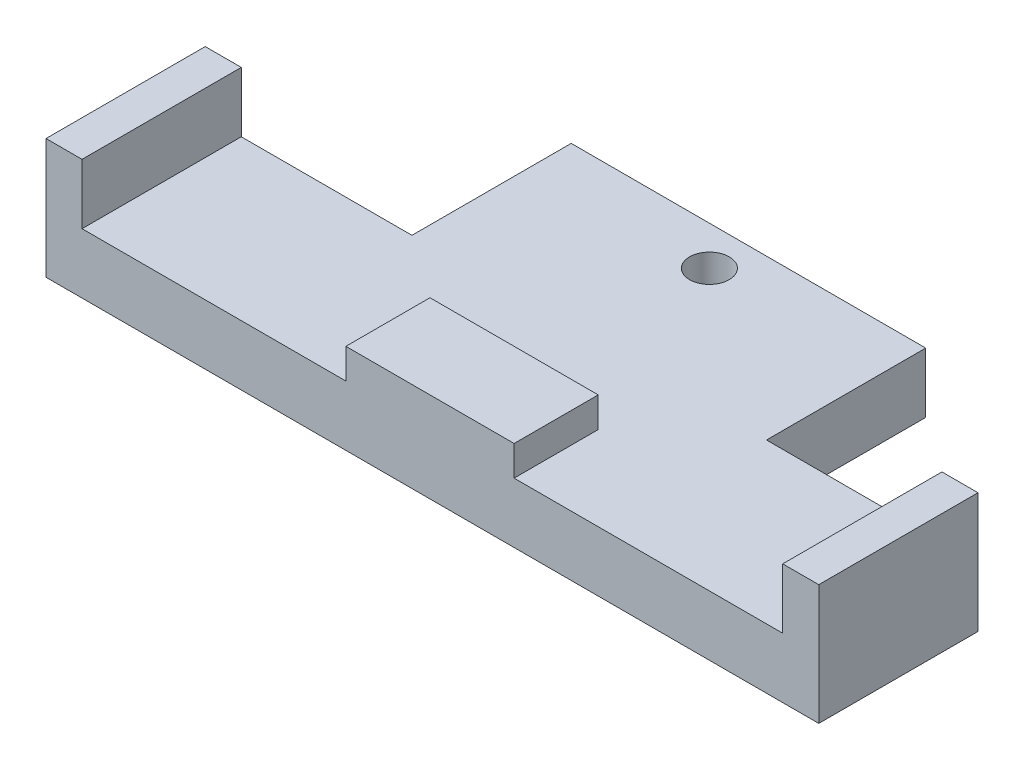
ISO-10303-21;
HEADER;
FILE_DESCRIPTION(('STEP AP214'),'2;1');
FILE_NAME('part.step','',(''),(''),'','','');
FILE_SCHEMA(('AUTOMOTIVE_DESIGN { 1 0 10303 214 1 1 1 1 }'));
ENDSEC;
DATA;
#1=APPLICATION_CONTEXT('core data for automotive mechanical design processes');
#2=APPLICATION_PROTOCOL_DEFINITION('international standard','automotive_design',2000,#1);
#3=PRODUCT_CONTEXT('',#1,'mechanical');
#4=PRODUCT('Part','Part','',(#3));
#5=PRODUCT_RELATED_PRODUCT_CATEGORY('part','',(#4));
#6=PRODUCT_DEFINITION_FORMATION('','',#4);
#7=PRODUCT_DEFINITION_CONTEXT('part definition',#1,'design');
#8=PRODUCT_DEFINITION('design','',#6,#7);
#9=PRODUCT_DEFINITION_SHAPE('','',#8);
#10=(LENGTH_UNIT() NAMED_UNIT(*) SI_UNIT(.MILLI.,.METRE.));
#11=(NAMED_UNIT(*) PLANE_ANGLE_UNIT() SI_UNIT($,.RADIAN.));
#12=(NAMED_UNIT(*) SI_UNIT($,.STERADIAN.) SOLID_ANGLE_UNIT());
#13=UNCERTAINTY_MEASURE_WITH_UNIT(LENGTH_MEASURE(1.E-05),#10,'distance_accuracy_value','');
#14=(GEOMETRIC_REPRESENTATION_CONTEXT(3) GLOBAL_UNCERTAINTY_ASSIGNED_CONTEXT((#13)) GLOBAL_UNIT_ASSIGNED_CONTEXT((#10,
#11,#12)) REPRESENTATION_CONTEXT('',''));
#15=CARTESIAN_POINT('',(0.,0.,0.));
#16=DIRECTION('',(0.,0.,1.));
#17=DIRECTION('',(1.,0.,0.));
#18=AXIS2_PLACEMENT_3D('',#15,#16,#17);
#19=CARTESIAN_POINT('',(0.,5.,0.));
#20=DIRECTION('',(0.,1.,0.));
#21=DIRECTION('',(0.,0.,1.));
#22=AXIS2_PLACEMENT_3D('',#19,#20,#21);
#23=PLANE('',#22);
#24=CARTESIAN_POINT('',(0.,5.,0.));
#25=DIRECTION('',(0.,1.,0.));
#26=DIRECTION('',(0.,0.,1.));
#27=AXIS2_PLACEMENT_3D('',#24,#25,#26);
#28=CIRCLE('',#27,1.65);
#29=CARTESIAN_POINT('',(0.,5.,1.65));
#30=VERTEX_POINT('',#29);
#31=EDGE_CURVE('E315',#30,#30,#28,.T.);
#32=ORIENTED_EDGE('',*,*,#31,.F.);
#33=EDGE_LOOP('',(#32));
#34=FACE_BOUND('',#33,.T.);
#35=DIRECTION('',(-1.,0.,0.));
#36=VECTOR('',#35,1.);
#37=CARTESIAN_POINT('',(7.,5.,16.25));
#38=LINE('',#37,#36);
#39=CARTESIAN_POINT('',(7.,5.,16.25));
#40=VERTEX_POINT('',#39);
#41=CARTESIAN_POINT('',(-7.,5.,16.25));
#42=VERTEX_POINT('',#41);
#43=EDGE_CURVE('E198',#40,#42,#38,.T.);
#44=ORIENTED_EDGE('',*,*,#43,.F.);
#45=DIRECTION('',(0.,0.,-1.));
#46=VECTOR('',#45,1.);
#47=CARTESIAN_POINT('',(7.,5.,23.25));
#48=LINE('',#47,#46);
#49=CARTESIAN_POINT('',(7.,5.,23.25));
#50=VERTEX_POINT('',#49);
#51=EDGE_CURVE('E195',#50,#40,#48,.T.);
#52=ORIENTED_EDGE('',*,*,#51,.F.);
#53=DIRECTION('',(1.,0.,0.));
#54=VECTOR('',#53,1.);
#55=CARTESIAN_POINT('',(0.,5.,23.25));
#56=LINE('',#55,#54);
#57=CARTESIAN_POINT('',(29.35,5.,23.25));
#58=VERTEX_POINT('',#57);
#59=EDGE_CURVE('E176',#50,#58,#56,.T.);
#60=ORIENTED_EDGE('',*,*,#59,.T.);
#61=DIRECTION('',(0.,0.,-1.));
#62=VECTOR('',#61,1.);
#63=CARTESIAN_POINT('',(29.35,5.,10.));
#64=LINE('',#63,#62);
#65=CARTESIAN_POINT('',(29.35,5.,10.));
#66=VERTEX_POINT('',#65);
#67=EDGE_CURVE('E280',#58,#66,#64,.T.);
#68=ORIENTED_EDGE('',*,*,#67,.T.);
#69=DIRECTION('',(-1.,0.,0.));
#70=VECTOR('',#69,1.);
#71=CARTESIAN_POINT('',(14.75,5.,10.));
#72=LINE('',#71,#70);
#73=CARTESIAN_POINT('',(14.75,5.,10.));
#74=VERTEX_POINT('',#73);
#75=EDGE_CURVE('E288',#66,#74,#72,.T.);
#76=ORIENTED_EDGE('',*,*,#75,.T.);
#77=DIRECTION('',(0.,0.,1.));
#78=VECTOR('',#77,1.);
#79=CARTESIAN_POINT('',(14.75,5.,0.));
#80=LINE('',#79,#78);
#81=CARTESIAN_POINT('',(14.75,5.,-3.25));
#82=VERTEX_POINT('',#81);
#83=EDGE_CURVE('E299',#82,#74,#80,.T.);
#84=ORIENTED_EDGE('',*,*,#83,.F.);
#85=DIRECTION('',(1.,0.,0.));
#86=VECTOR('',#85,1.);
#87=CARTESIAN_POINT('',(0.,5.,-3.25));
#88=LINE('',#87,#86);
#89=CARTESIAN_POINT('',(-14.75,5.,-3.25));
#90=VERTEX_POINT('',#89);
#91=EDGE_CURVE('E302',#90,#82,#88,.T.);
#92=ORIENTED_EDGE('',*,*,#91,.F.);
#93=DIRECTION('',(0.,0.,1.));
#94=VECTOR('',#93,1.);
#95=CARTESIAN_POINT('',(-14.75,5.,0.));
#96=LINE('',#95,#94);
#97=CARTESIAN_POINT('',(-14.75,5.,10.));
#98=VERTEX_POINT('',#97);
#99=EDGE_CURVE('E307',#90,#98,#96,.T.);
#100=ORIENTED_EDGE('',*,*,#99,.T.);
#101=DIRECTION('',(-1.,0.,0.));
#102=VECTOR('',#101,1.);
#103=CARTESIAN_POINT('',(-14.75,5.,10.));
#104=LINE('',#103,#102);
#105=CARTESIAN_POINT('',(-28.95,5.,10.));
#106=VERTEX_POINT('',#105);
#107=EDGE_CURVE('E69',#98,#106,#104,.T.);
#108=ORIENTED_EDGE('',*,*,#107,.T.);
#109=DIRECTION('',(0.,0.,1.));
#110=VECTOR('',#109,1.);
#111=CARTESIAN_POINT('',(-28.95,5.,10.));
#112=LINE('',#111,#110);
#113=CARTESIAN_POINT('',(-28.95,5.,23.25));
#114=VERTEX_POINT('',#113);
#115=EDGE_CURVE('E274',#106,#114,#112,.T.);
#116=ORIENTED_EDGE('',*,*,#115,.T.);
#117=CARTESIAN_POINT('',(-7.,5.,23.25));
#118=VERTEX_POINT('',#117);
#119=EDGE_CURVE('E311',#114,#118,#56,.T.);
#120=ORIENTED_EDGE('',*,*,#119,.T.);
#121=DIRECTION('',(0.,0.,1.));
#122=VECTOR('',#121,1.);
#123=CARTESIAN_POINT('',(-7.,5.,16.25));
#124=LINE('',#123,#122);
#125=EDGE_CURVE('E170',#42,#118,#124,.T.);
#126=ORIENTED_EDGE('',*,*,#125,.F.);
#127=EDGE_LOOP('',(#44,#52,#60,#68,#76,#84,#92,#100,#108,#116,#120,#126));
#128=FACE_BOUND('',#127,.T.);
#129=ADVANCED_FACE('F45',(#34,#128),#23,.T.);
#130=CARTESIAN_POINT('',(14.75,5.,0.));
#131=DIRECTION('',(1.,0.,0.));
#132=DIRECTION('',(0.,0.,-1.));
#133=AXIS2_PLACEMENT_3D('',#130,#131,#132);
#134=PLANE('',#133);
#135=DIRECTION('',(0.,1.,0.));
#136=VECTOR('',#135,1.);
#137=CARTESIAN_POINT('',(14.75,0.,10.));
#138=LINE('',#137,#136);
#139=CARTESIAN_POINT('',(14.75,0.,10.));
#140=VERTEX_POINT('',#139);
#141=EDGE_CURVE('E287',#140,#74,#138,.T.);
#142=ORIENTED_EDGE('',*,*,#141,.F.);
#143=DIRECTION('',(0.,0.,1.));
#144=VECTOR('',#143,1.);
#145=CARTESIAN_POINT('',(14.75,0.,0.));
#146=LINE('',#145,#144);
#147=CARTESIAN_POINT('',(14.75,0.,-3.25));
#148=VERTEX_POINT('',#147);
#149=EDGE_CURVE('E298',#148,#140,#146,.T.);
#150=ORIENTED_EDGE('',*,*,#149,.F.);
#151=DIRECTION('',(0.,-1.,0.));
#152=VECTOR('',#151,1.);
#153=CARTESIAN_POINT('',(14.75,5.,-3.25));
#154=LINE('',#153,#152);
#155=EDGE_CURVE('E11',#82,#148,#154,.T.);
#156=ORIENTED_EDGE('',*,*,#155,.F.);
#157=ORIENTED_EDGE('',*,*,#83,.T.);
#158=EDGE_LOOP('',(#142,#150,#156,#157));
#159=FACE_BOUND('',#158,.T.);
#160=ADVANCED_FACE('F47',(#159),#134,.T.);
#161=CARTESIAN_POINT('',(0.,5.,-3.25));
#162=DIRECTION('',(0.,0.,-1.));
#163=DIRECTION('',(-1.,0.,0.));
#164=AXIS2_PLACEMENT_3D('',#161,#162,#163);
#165=PLANE('',#164);
#166=DIRECTION('',(1.,0.,0.));
#167=VECTOR('',#166,1.);
#168=CARTESIAN_POINT('',(0.,0.,-3.25));
#169=LINE('',#168,#167);
#170=CARTESIAN_POINT('',(-14.75,0.,-3.25));
#171=VERTEX_POINT('',#170);
#172=EDGE_CURVE('E322',#171,#148,#169,.T.);
#173=ORIENTED_EDGE('',*,*,#172,.F.);
#174=DIRECTION('',(0.,-1.,0.));
#175=VECTOR('',#174,1.);
#176=CARTESIAN_POINT('',(-14.75,5.,-3.25));
#177=LINE('',#176,#175);
#178=EDGE_CURVE('E54',#90,#171,#177,.T.);
#179=ORIENTED_EDGE('',*,*,#178,.F.);
#180=ORIENTED_EDGE('',*,*,#91,.T.);
#181=ORIENTED_EDGE('',*,*,#155,.T.);
#182=EDGE_LOOP('',(#173,#179,#180,#181));
#183=FACE_BOUND('',#182,.T.);
#184=ADVANCED_FACE('F348',(#183),#165,.T.);
#185=CARTESIAN_POINT('',(-14.75,5.,0.));
#186=DIRECTION('',(1.,0.,0.));
#187=DIRECTION('',(0.,0.,-1.));
#188=AXIS2_PLACEMENT_3D('',#185,#186,#187);
#189=PLANE('',#188);
#190=DIRECTION('',(0.,0.,1.));
#191=VECTOR('',#190,1.);
#192=CARTESIAN_POINT('',(-14.75,0.,0.));
#193=LINE('',#192,#191);
#194=CARTESIAN_POINT('',(-14.75,0.,10.));
#195=VERTEX_POINT('',#194);
#196=EDGE_CURVE('E326',#171,#195,#193,.T.);
#197=ORIENTED_EDGE('',*,*,#196,.T.);
#198=DIRECTION('',(0.,1.,0.));
#199=VECTOR('',#198,1.);
#200=CARTESIAN_POINT('',(-14.75,0.,10.));
#201=LINE('',#200,#199);
#202=EDGE_CURVE('E270',#195,#98,#201,.T.);
#203=ORIENTED_EDGE('',*,*,#202,.T.);
#204=ORIENTED_EDGE('',*,*,#99,.F.);
#205=ORIENTED_EDGE('',*,*,#178,.T.);
#206=EDGE_LOOP('',(#197,#203,#204,#205));
#207=FACE_BOUND('',#206,.T.);
#208=ADVANCED_FACE('F339',(#207),#189,.F.);
#209=CARTESIAN_POINT('',(0.,5.,23.25));
#210=DIRECTION('',(0.,0.,-1.));
#211=DIRECTION('',(-1.,0.,0.));
#212=AXIS2_PLACEMENT_3D('',#209,#210,#211);
#213=PLANE('',#212);
#214=DIRECTION('',(1.,0.,0.));
#215=VECTOR('',#214,1.);
#216=CARTESIAN_POINT('',(0.,0.,23.25));
#217=LINE('',#216,#215);
#218=CARTESIAN_POINT('',(-31.95,0.,23.25));
#219=VERTEX_POINT('',#218);
#220=CARTESIAN_POINT('',(32.35,0.,23.25));
#221=VERTEX_POINT('',#220);
#222=EDGE_CURVE('E330',#219,#221,#217,.T.);
#223=ORIENTED_EDGE('',*,*,#222,.T.);
#224=DIRECTION('',(0.,-1.,0.));
#225=VECTOR('',#224,1.);
#226=CARTESIAN_POINT('',(32.35,10.,23.25));
#227=LINE('',#226,#225);
#228=CARTESIAN_POINT('',(32.35,10.,23.25));
#229=VERTEX_POINT('',#228);
#230=EDGE_CURVE('E211',#229,#221,#227,.T.);
#231=ORIENTED_EDGE('',*,*,#230,.F.);
#232=DIRECTION('',(1.,0.,0.));
#233=VECTOR('',#232,1.);
#234=CARTESIAN_POINT('',(29.35,10.,23.25));
#235=LINE('',#234,#233);
#236=CARTESIAN_POINT('',(29.35,10.,23.25));
#237=VERTEX_POINT('',#236);
#238=EDGE_CURVE('E234',#237,#229,#235,.T.);
#239=ORIENTED_EDGE('',*,*,#238,.F.);
#240=DIRECTION('',(0.,-1.,0.));
#241=VECTOR('',#240,1.);
#242=CARTESIAN_POINT('',(29.35,10.,23.25));
#243=LINE('',#242,#241);
#244=EDGE_CURVE('E180',#237,#58,#243,.T.);
#245=ORIENTED_EDGE('',*,*,#244,.T.);
#246=ORIENTED_EDGE('',*,*,#59,.F.);
#247=DIRECTION('',(0.,-1.,0.));
#248=VECTOR('',#247,1.);
#249=CARTESIAN_POINT('',(7.,7.5,23.25));
#250=LINE('',#249,#248);
#251=CARTESIAN_POINT('',(7.,7.5,23.25));
#252=VERTEX_POINT('',#251);
#253=EDGE_CURVE('E173',#252,#50,#250,.T.);
#254=ORIENTED_EDGE('',*,*,#253,.F.);
#255=DIRECTION('',(1.,0.,0.));
#256=VECTOR('',#255,1.);
#257=CARTESIAN_POINT('',(-7.,7.5,23.25));
#258=LINE('',#257,#256);
#259=CARTESIAN_POINT('',(-7.,7.5,23.25));
#260=VERTEX_POINT('',#259);
#261=EDGE_CURVE('E159',#260,#252,#258,.T.);
#262=ORIENTED_EDGE('',*,*,#261,.F.);
#263=DIRECTION('',(0.,-1.,0.));
#264=VECTOR('',#263,1.);
#265=CARTESIAN_POINT('',(-7.,7.5,23.25));
#266=LINE('',#265,#264);
#267=EDGE_CURVE('E194',#260,#118,#266,.T.);
#268=ORIENTED_EDGE('',*,*,#267,.T.);
#269=ORIENTED_EDGE('',*,*,#119,.F.);
#270=DIRECTION('',(0.,-1.,0.));
#271=VECTOR('',#270,1.);
#272=CARTESIAN_POINT('',(-28.95,10.,23.25));
#273=LINE('',#272,#271);
#274=CARTESIAN_POINT('',(-28.95,10.,23.25));
#275=VERTEX_POINT('',#274);
#276=EDGE_CURVE('E253',#275,#114,#273,.T.);
#277=ORIENTED_EDGE('',*,*,#276,.F.);
#278=DIRECTION('',(1.,0.,0.));
#279=VECTOR('',#278,1.);
#280=CARTESIAN_POINT('',(-28.95,10.,23.25));
#281=LINE('',#280,#279);
#282=CARTESIAN_POINT('',(-31.95,10.,23.25));
#283=VERTEX_POINT('',#282);
#284=EDGE_CURVE('E250',#283,#275,#281,.T.);
#285=ORIENTED_EDGE('',*,*,#284,.F.);
#286=DIRECTION('',(0.,-1.,0.));
#287=VECTOR('',#286,1.);
#288=CARTESIAN_POINT('',(-31.95,10.,23.25));
#289=LINE('',#288,#287);
#290=EDGE_CURVE('E259',#283,#219,#289,.T.);
#291=ORIENTED_EDGE('',*,*,#290,.T.);
#292=EDGE_LOOP('',(#223,#231,#239,#245,#246,#254,#262,#268,#269,#277,#285,#291));
#293=FACE_BOUND('',#292,.T.);
#294=ADVANCED_FACE('F174',(#293),#213,.F.);
#295=CARTESIAN_POINT('',(0.,5.,0.));
#296=DIRECTION('',(0.,-1.,0.));
#297=DIRECTION('',(0.,0.,-1.));
#298=AXIS2_PLACEMENT_3D('',#295,#296,#297);
#299=CYLINDRICAL_SURFACE('',#298,1.65);
#300=ORIENTED_EDGE('',*,*,#31,.T.);
#301=EDGE_LOOP('',(#300));
#302=FACE_BOUND('',#301,.T.);
#303=CARTESIAN_POINT('',(0.,0.,0.));
#304=DIRECTION('',(0.,1.,0.));
#305=DIRECTION('',(0.,0.,1.));
#306=AXIS2_PLACEMENT_3D('',#303,#304,#305);
#307=CIRCLE('',#306,1.65);
#308=CARTESIAN_POINT('',(0.,0.,1.65));
#309=VERTEX_POINT('',#308);
#310=EDGE_CURVE('E303',#309,#309,#307,.T.);
#311=ORIENTED_EDGE('',*,*,#310,.F.);
#312=EDGE_LOOP('',(#311));
#313=FACE_BOUND('',#312,.T.);
#314=ADVANCED_FACE('F409',(#302,#313),#299,.F.);
#315=CARTESIAN_POINT('',(0.,0.,0.));
#316=DIRECTION('',(0.,1.,0.));
#317=DIRECTION('',(0.,0.,1.));
#318=AXIS2_PLACEMENT_3D('',#315,#316,#317);
#319=PLANE('',#318);
#320=ORIENTED_EDGE('',*,*,#149,.T.);
#321=DIRECTION('',(-1.,0.,0.));
#322=VECTOR('',#321,1.);
#323=CARTESIAN_POINT('',(14.75,0.,10.));
#324=LINE('',#323,#322);
#325=CARTESIAN_POINT('',(32.35,0.,10.));
#326=VERTEX_POINT('',#325);
#327=EDGE_CURVE('E283',#326,#140,#324,.T.);
#328=ORIENTED_EDGE('',*,*,#327,.F.);
#329=DIRECTION('',(0.,0.,-1.));
#330=VECTOR('',#329,1.);
#331=CARTESIAN_POINT('',(32.35,0.,10.));
#332=LINE('',#331,#330);
#333=EDGE_CURVE('E223',#221,#326,#332,.T.);
#334=ORIENTED_EDGE('',*,*,#333,.F.);
#335=ORIENTED_EDGE('',*,*,#222,.F.);
#336=DIRECTION('',(0.,0.,1.));
#337=VECTOR('',#336,1.);
#338=CARTESIAN_POINT('',(-31.95,0.,10.));
#339=LINE('',#338,#337);
#340=CARTESIAN_POINT('',(-31.95,0.,10.));
#341=VERTEX_POINT('',#340);
#342=EDGE_CURVE('E227',#341,#219,#339,.T.);
#343=ORIENTED_EDGE('',*,*,#342,.F.);
#344=DIRECTION('',(-1.,0.,0.));
#345=VECTOR('',#344,1.);
#346=CARTESIAN_POINT('',(-14.75,0.,10.));
#347=LINE('',#346,#345);
#348=EDGE_CURVE('E273',#195,#341,#347,.T.);
#349=ORIENTED_EDGE('',*,*,#348,.F.);
#350=ORIENTED_EDGE('',*,*,#196,.F.);
#351=ORIENTED_EDGE('',*,*,#172,.T.);
#352=EDGE_LOOP('',(#320,#328,#334,#335,#343,#349,#350,#351));
#353=FACE_BOUND('',#352,.T.);
#354=ORIENTED_EDGE('',*,*,#310,.T.);
#355=EDGE_LOOP('',(#354));
#356=FACE_BOUND('',#355,.T.);
#357=ADVANCED_FACE('F345',(#353,#356),#319,.F.);
#358=CARTESIAN_POINT('',(14.75,0.,10.));
#359=DIRECTION('',(0.,0.,-1.));
#360=DIRECTION('',(-1.,0.,0.));
#361=AXIS2_PLACEMENT_3D('',#358,#359,#360);
#362=PLANE('',#361);
#363=ORIENTED_EDGE('',*,*,#75,.F.);
#364=DIRECTION('',(0.,-1.,0.));
#365=VECTOR('',#364,1.);
#366=CARTESIAN_POINT('',(29.35,10.,10.));
#367=LINE('',#366,#365);
#368=CARTESIAN_POINT('',(29.35,10.,10.));
#369=VERTEX_POINT('',#368);
#370=EDGE_CURVE('E219',#369,#66,#367,.T.);
#371=ORIENTED_EDGE('',*,*,#370,.F.);
#372=DIRECTION('',(-1.,0.,0.));
#373=VECTOR('',#372,1.);
#374=CARTESIAN_POINT('',(29.35,10.,10.));
#375=LINE('',#374,#373);
#376=CARTESIAN_POINT('',(32.35,10.,10.));
#377=VERTEX_POINT('',#376);
#378=EDGE_CURVE('E222',#377,#369,#375,.T.);
#379=ORIENTED_EDGE('',*,*,#378,.F.);
#380=DIRECTION('',(0.,-1.,0.));
#381=VECTOR('',#380,1.);
#382=CARTESIAN_POINT('',(32.35,10.,10.));
#383=LINE('',#382,#381);
#384=EDGE_CURVE('E215',#377,#326,#383,.T.);
#385=ORIENTED_EDGE('',*,*,#384,.T.);
#386=ORIENTED_EDGE('',*,*,#327,.T.);
#387=ORIENTED_EDGE('',*,*,#141,.T.);
#388=EDGE_LOOP('',(#363,#371,#379,#385,#386,#387));
#389=FACE_BOUND('',#388,.T.);
#390=ADVANCED_FACE('F355',(#389),#362,.T.);
#391=CARTESIAN_POINT('',(-14.75,0.,10.));
#392=DIRECTION('',(0.,0.,-1.));
#393=DIRECTION('',(-1.,0.,0.));
#394=AXIS2_PLACEMENT_3D('',#391,#392,#393);
#395=PLANE('',#394);
#396=ORIENTED_EDGE('',*,*,#107,.F.);
#397=ORIENTED_EDGE('',*,*,#202,.F.);
#398=ORIENTED_EDGE('',*,*,#348,.T.);
#399=DIRECTION('',(0.,-1.,0.));
#400=VECTOR('',#399,1.);
#401=CARTESIAN_POINT('',(-31.95,10.,10.));
#402=LINE('',#401,#400);
#403=CARTESIAN_POINT('',(-31.95,10.,10.));
#404=VERTEX_POINT('',#403);
#405=EDGE_CURVE('E263',#404,#341,#402,.T.);
#406=ORIENTED_EDGE('',*,*,#405,.F.);
#407=DIRECTION('',(-1.,0.,0.));
#408=VECTOR('',#407,1.);
#409=CARTESIAN_POINT('',(-28.95,10.,10.));
#410=LINE('',#409,#408);
#411=CARTESIAN_POINT('',(-28.95,10.,10.));
#412=VERTEX_POINT('',#411);
#413=EDGE_CURVE('E244',#412,#404,#410,.T.);
#414=ORIENTED_EDGE('',*,*,#413,.F.);
#415=DIRECTION('',(0.,-1.,0.));
#416=VECTOR('',#415,1.);
#417=CARTESIAN_POINT('',(-28.95,10.,10.));
#418=LINE('',#417,#416);
#419=EDGE_CURVE('E267',#412,#106,#418,.T.);
#420=ORIENTED_EDGE('',*,*,#419,.T.);
#421=EDGE_LOOP('',(#396,#397,#398,#406,#414,#420));
#422=FACE_BOUND('',#421,.T.);
#423=ADVANCED_FACE('F375',(#422),#395,.T.);
#424=CARTESIAN_POINT('',(-28.95,10.,10.));
#425=DIRECTION('',(-1.,0.,0.));
#426=DIRECTION('',(0.,0.,1.));
#427=AXIS2_PLACEMENT_3D('',#424,#425,#426);
#428=PLANE('',#427);
#429=ORIENTED_EDGE('',*,*,#115,.F.);
#430=ORIENTED_EDGE('',*,*,#419,.F.);
#431=DIRECTION('',(0.,0.,-1.));
#432=VECTOR('',#431,1.);
#433=CARTESIAN_POINT('',(-28.95,10.,10.));
#434=LINE('',#433,#432);
#435=EDGE_CURVE('E240',#275,#412,#434,.T.);
#436=ORIENTED_EDGE('',*,*,#435,.F.);
#437=ORIENTED_EDGE('',*,*,#276,.T.);
#438=EDGE_LOOP('',(#429,#430,#436,#437));
#439=FACE_BOUND('',#438,.T.);
#440=ADVANCED_FACE('F449',(#439),#428,.F.);
#441=CARTESIAN_POINT('',(-31.95,10.,10.));
#442=DIRECTION('',(1.,0.,0.));
#443=DIRECTION('',(0.,0.,-1.));
#444=AXIS2_PLACEMENT_3D('',#441,#442,#443);
#445=PLANE('',#444);
#446=ORIENTED_EDGE('',*,*,#342,.T.);
#447=ORIENTED_EDGE('',*,*,#290,.F.);
#448=DIRECTION('',(0.,0.,1.));
#449=VECTOR('',#448,1.);
#450=CARTESIAN_POINT('',(-31.95,10.,10.));
#451=LINE('',#450,#449);
#452=EDGE_CURVE('E247',#404,#283,#451,.T.);
#453=ORIENTED_EDGE('',*,*,#452,.F.);
#454=ORIENTED_EDGE('',*,*,#405,.T.);
#455=EDGE_LOOP('',(#446,#447,#453,#454));
#456=FACE_BOUND('',#455,.T.);
#457=ADVANCED_FACE('F365',(#456),#445,.F.);
#458=CARTESIAN_POINT('',(0.,10.,0.));
#459=DIRECTION('',(0.,-1.,0.));
#460=DIRECTION('',(0.,0.,-1.));
#461=AXIS2_PLACEMENT_3D('',#458,#459,#460);
#462=PLANE('',#461);
#463=ORIENTED_EDGE('',*,*,#435,.T.);
#464=ORIENTED_EDGE('',*,*,#413,.T.);
#465=ORIENTED_EDGE('',*,*,#452,.T.);
#466=ORIENTED_EDGE('',*,*,#284,.T.);
#467=EDGE_LOOP('',(#463,#464,#465,#466));
#468=FACE_BOUND('',#467,.T.);
#469=ADVANCED_FACE('F373',(#468),#462,.F.);
#470=CARTESIAN_POINT('',(29.35,10.,10.));
#471=DIRECTION('',(1.,0.,0.));
#472=DIRECTION('',(0.,0.,-1.));
#473=AXIS2_PLACEMENT_3D('',#470,#471,#472);
#474=PLANE('',#473);
#475=ORIENTED_EDGE('',*,*,#67,.F.);
#476=ORIENTED_EDGE('',*,*,#244,.F.);
#477=DIRECTION('',(0.,0.,1.));
#478=VECTOR('',#477,1.);
#479=CARTESIAN_POINT('',(29.35,10.,10.));
#480=LINE('',#479,#478);
#481=EDGE_CURVE('E228',#369,#237,#480,.T.);
#482=ORIENTED_EDGE('',*,*,#481,.F.);
#483=ORIENTED_EDGE('',*,*,#370,.T.);
#484=EDGE_LOOP('',(#475,#476,#482,#483));
#485=FACE_BOUND('',#484,.T.);
#486=ADVANCED_FACE('F382',(#485),#474,.F.);
#487=CARTESIAN_POINT('',(32.35,10.,10.));
#488=DIRECTION('',(-1.,0.,0.));
#489=DIRECTION('',(0.,0.,1.));
#490=AXIS2_PLACEMENT_3D('',#487,#488,#489);
#491=PLANE('',#490);
#492=ORIENTED_EDGE('',*,*,#333,.T.);
#493=ORIENTED_EDGE('',*,*,#384,.F.);
#494=DIRECTION('',(0.,0.,-1.));
#495=VECTOR('',#494,1.);
#496=CARTESIAN_POINT('',(32.35,10.,10.));
#497=LINE('',#496,#495);
#498=EDGE_CURVE('E231',#229,#377,#497,.T.);
#499=ORIENTED_EDGE('',*,*,#498,.F.);
#500=ORIENTED_EDGE('',*,*,#230,.T.);
#501=EDGE_LOOP('',(#492,#493,#499,#500));
#502=FACE_BOUND('',#501,.T.);
#503=ADVANCED_FACE('F361',(#502),#491,.F.);
#504=CARTESIAN_POINT('',(0.,10.,0.));
#505=DIRECTION('',(0.,1.,0.));
#506=DIRECTION('',(0.,0.,1.));
#507=AXIS2_PLACEMENT_3D('',#504,#505,#506);
#508=PLANE('',#507);
#509=ORIENTED_EDGE('',*,*,#481,.T.);
#510=ORIENTED_EDGE('',*,*,#238,.T.);
#511=ORIENTED_EDGE('',*,*,#498,.T.);
#512=ORIENTED_EDGE('',*,*,#378,.T.);
#513=EDGE_LOOP('',(#509,#510,#511,#512));
#514=FACE_BOUND('',#513,.T.);
#515=ADVANCED_FACE('F384',(#514),#508,.T.);
#516=CARTESIAN_POINT('',(7.,7.5,23.25));
#517=DIRECTION('',(-1.,0.,0.));
#518=DIRECTION('',(0.,0.,1.));
#519=AXIS2_PLACEMENT_3D('',#516,#517,#518);
#520=PLANE('',#519);
#521=ORIENTED_EDGE('',*,*,#51,.T.);
#522=DIRECTION('',(0.,-1.,0.));
#523=VECTOR('',#522,1.);
#524=CARTESIAN_POINT('',(7.,7.5,16.25));
#525=LINE('',#524,#523);
#526=CARTESIAN_POINT('',(7.,7.5,16.25));
#527=VERTEX_POINT('',#526);
#528=EDGE_CURVE('E181',#527,#40,#525,.T.);
#529=ORIENTED_EDGE('',*,*,#528,.F.);
#530=DIRECTION('',(0.,0.,-1.));
#531=VECTOR('',#530,1.);
#532=CARTESIAN_POINT('',(7.,7.5,23.25));
#533=LINE('',#532,#531);
#534=EDGE_CURVE('E163',#252,#527,#533,.T.);
#535=ORIENTED_EDGE('',*,*,#534,.F.);
#536=ORIENTED_EDGE('',*,*,#253,.T.);
#537=EDGE_LOOP('',(#521,#529,#535,#536));
#538=FACE_BOUND('',#537,.T.);
#539=ADVANCED_FACE('F183',(#538),#520,.F.);
#540=CARTESIAN_POINT('',(7.,7.5,16.25));
#541=DIRECTION('',(0.,0.,1.));
#542=DIRECTION('',(1.,0.,0.));
#543=AXIS2_PLACEMENT_3D('',#540,#541,#542);
#544=PLANE('',#543);
#545=ORIENTED_EDGE('',*,*,#43,.T.);
#546=DIRECTION('',(0.,-1.,0.));
#547=VECTOR('',#546,1.);
#548=CARTESIAN_POINT('',(-7.,7.5,16.25));
#549=LINE('',#548,#547);
#550=CARTESIAN_POINT('',(-7.,7.5,16.25));
#551=VERTEX_POINT('',#550);
#552=EDGE_CURVE('E61',#551,#42,#549,.T.);
#553=ORIENTED_EDGE('',*,*,#552,.F.);
#554=DIRECTION('',(-1.,0.,0.));
#555=VECTOR('',#554,1.);
#556=CARTESIAN_POINT('',(7.,7.5,16.25));
#557=LINE('',#556,#555);
#558=EDGE_CURVE('E187',#527,#551,#557,.T.);
#559=ORIENTED_EDGE('',*,*,#558,.F.);
#560=ORIENTED_EDGE('',*,*,#528,.T.);
#561=EDGE_LOOP('',(#545,#553,#559,#560));
#562=FACE_BOUND('',#561,.T.);
#563=ADVANCED_FACE('F392',(#562),#544,.F.);
#564=CARTESIAN_POINT('',(-7.,7.5,16.25));
#565=DIRECTION('',(1.,0.,0.));
#566=DIRECTION('',(0.,0.,-1.));
#567=AXIS2_PLACEMENT_3D('',#564,#565,#566);
#568=PLANE('',#567);
#569=ORIENTED_EDGE('',*,*,#125,.T.);
#570=ORIENTED_EDGE('',*,*,#267,.F.);
#571=DIRECTION('',(0.,0.,1.));
#572=VECTOR('',#571,1.);
#573=CARTESIAN_POINT('',(-7.,7.5,16.25));
#574=LINE('',#573,#572);
#575=EDGE_CURVE('E165',#551,#260,#574,.T.);
#576=ORIENTED_EDGE('',*,*,#575,.F.);
#577=ORIENTED_EDGE('',*,*,#552,.T.);
#578=EDGE_LOOP('',(#569,#570,#576,#577));
#579=FACE_BOUND('',#578,.T.);
#580=ADVANCED_FACE('F528',(#579),#568,.F.);
#581=CARTESIAN_POINT('',(0.,7.5,0.));
#582=DIRECTION('',(0.,1.,0.));
#583=DIRECTION('',(0.,0.,1.));
#584=AXIS2_PLACEMENT_3D('',#581,#582,#583);
#585=PLANE('',#584);
#586=ORIENTED_EDGE('',*,*,#261,.T.);
#587=ORIENTED_EDGE('',*,*,#534,.T.);
#588=ORIENTED_EDGE('',*,*,#558,.T.);
#589=ORIENTED_EDGE('',*,*,#575,.T.);
#590=EDGE_LOOP('',(#586,#587,#588,#589));
#591=FACE_BOUND('',#590,.T.);
#592=ADVANCED_FACE('F161',(#591),#585,.T.);
#593=CLOSED_SHELL('',(#129,#160,#184,#208,#294,#314,#357,#390,#423,#440,#457,#469,#486,#503,
#515,#539,#563,#580,#592));
#594=MANIFOLD_SOLID_BREP('B2',#593);
#595=ADVANCED_BREP_SHAPE_REPRESENTATION('',(#18,#594),#14);
#596=SHAPE_DEFINITION_REPRESENTATION(#9,#595);
ENDSEC;
END-ISO-10303-21;
